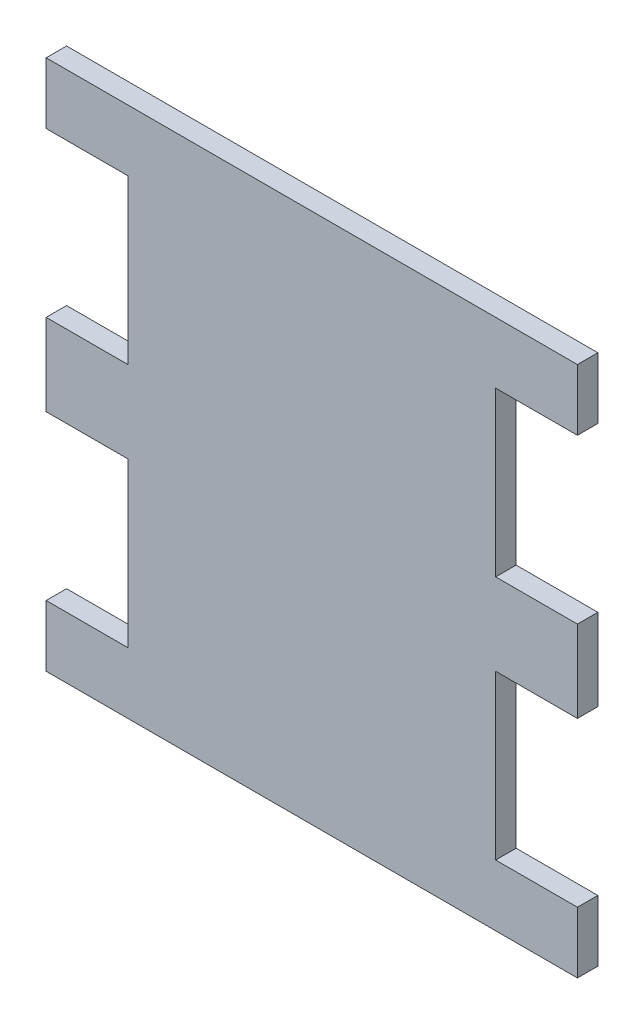
ISO-10303-21;
HEADER;
FILE_DESCRIPTION(('STEP AP214'),'2;1');
FILE_NAME('part.step','',(''),(''),'','','');
FILE_SCHEMA(('AUTOMOTIVE_DESIGN { 1 0 10303 214 1 1 1 1 }'));
ENDSEC;
DATA;
#1=APPLICATION_CONTEXT('core data for automotive mechanical design processes');
#2=APPLICATION_PROTOCOL_DEFINITION('international standard','automotive_design',2000,#1);
#3=PRODUCT_CONTEXT('',#1,'mechanical');
#4=PRODUCT('Part','Part','',(#3));
#5=PRODUCT_RELATED_PRODUCT_CATEGORY('part','',(#4));
#6=PRODUCT_DEFINITION_FORMATION('','',#4);
#7=PRODUCT_DEFINITION_CONTEXT('part definition',#1,'design');
#8=PRODUCT_DEFINITION('design','',#6,#7);
#9=PRODUCT_DEFINITION_SHAPE('','',#8);
#10=(LENGTH_UNIT() NAMED_UNIT(*) SI_UNIT(.MILLI.,.METRE.));
#11=(NAMED_UNIT(*) PLANE_ANGLE_UNIT() SI_UNIT($,.RADIAN.));
#12=(NAMED_UNIT(*) SI_UNIT($,.STERADIAN.) SOLID_ANGLE_UNIT());
#13=UNCERTAINTY_MEASURE_WITH_UNIT(LENGTH_MEASURE(1.E-05),#10,'distance_accuracy_value','');
#14=(GEOMETRIC_REPRESENTATION_CONTEXT(3) GLOBAL_UNCERTAINTY_ASSIGNED_CONTEXT((#13)) GLOBAL_UNIT_ASSIGNED_CONTEXT((#10,
#11,#12)) REPRESENTATION_CONTEXT('',''));
#15=CARTESIAN_POINT('',(0.,0.,0.));
#16=DIRECTION('',(0.,0.,1.));
#17=DIRECTION('',(1.,0.,0.));
#18=AXIS2_PLACEMENT_3D('',#15,#16,#17);
#19=CARTESIAN_POINT('',(96.5740993958003,41.5718700475436,5.));
#20=DIRECTION('',(-1.,0.,0.));
#21=DIRECTION('',(0.,-1.,0.));
#22=AXIS2_PLACEMENT_3D('',#19,#20,#21);
#23=PLANE('',#22);
#24=DIRECTION('',(0.,1.,0.));
#25=VECTOR('',#24,1.);
#26=CARTESIAN_POINT('',(96.5740993958003,41.5718700475436,0.));
#27=LINE('',#26,#25);
#28=CARTESIAN_POINT('',(96.5740993958003,-88.4281299524564,0.));
#29=VERTEX_POINT('',#28);
#30=CARTESIAN_POINT('',(96.5740993958003,-73.4281299524564,0.));
#31=VERTEX_POINT('',#30);
#32=EDGE_CURVE('E211',#29,#31,#27,.T.);
#33=ORIENTED_EDGE('',*,*,#32,.T.);
#34=DIRECTION('',(0.,0.,1.));
#35=VECTOR('',#34,1.);
#36=CARTESIAN_POINT('',(96.5740993958003,-73.4281299524564,-5.));
#37=LINE('',#36,#35);
#38=CARTESIAN_POINT('',(96.5740993958003,-73.4281299524564,5.));
#39=VERTEX_POINT('',#38);
#40=EDGE_CURVE('E265',#31,#39,#37,.T.);
#41=ORIENTED_EDGE('',*,*,#40,.T.);
#42=DIRECTION('',(0.,1.,0.));
#43=VECTOR('',#42,1.);
#44=CARTESIAN_POINT('',(96.5740993958003,41.5718700475436,5.));
#45=LINE('',#44,#43);
#46=CARTESIAN_POINT('',(96.5740993958003,-88.4281299524564,5.));
#47=VERTEX_POINT('',#46);
#48=EDGE_CURVE('E192',#47,#39,#45,.T.);
#49=ORIENTED_EDGE('',*,*,#48,.F.);
#50=DIRECTION('',(0.,0.,-1.));
#51=VECTOR('',#50,1.);
#52=CARTESIAN_POINT('',(96.5740993958003,-88.4281299524564,5.));
#53=LINE('',#52,#51);
#54=EDGE_CURVE('E223',#47,#29,#53,.T.);
#55=ORIENTED_EDGE('',*,*,#54,.T.);
#56=EDGE_LOOP('',(#33,#41,#49,#55));
#57=FACE_BOUND('',#56,.T.);
#58=ADVANCED_FACE('F32',(#57),#23,.F.);
#59=CARTESIAN_POINT('',(96.5740993958003,-33.4281299524564,5.));
#60=VERTEX_POINT('',#59);
#61=CARTESIAN_POINT('',(96.5740993958003,-13.4281299524564,5.));
#62=VERTEX_POINT('',#61);
#63=EDGE_CURVE('E183',#60,#62,#45,.T.);
#64=ORIENTED_EDGE('',*,*,#63,.F.);
#65=DIRECTION('',(0.,0.,1.));
#66=VECTOR('',#65,1.);
#67=CARTESIAN_POINT('',(96.5740993958003,-33.4281299524564,-5.));
#68=LINE('',#67,#66);
#69=CARTESIAN_POINT('',(96.5740993958003,-33.4281299524564,0.));
#70=VERTEX_POINT('',#69);
#71=EDGE_CURVE('E167',#70,#60,#68,.T.);
#72=ORIENTED_EDGE('',*,*,#71,.F.);
#73=CARTESIAN_POINT('',(96.5740993958003,-13.4281299524564,0.));
#74=VERTEX_POINT('',#73);
#75=EDGE_CURVE('E215',#70,#74,#27,.T.);
#76=ORIENTED_EDGE('',*,*,#75,.T.);
#77=DIRECTION('',(0.,0.,1.));
#78=VECTOR('',#77,1.);
#79=CARTESIAN_POINT('',(96.5740993958003,-13.4281299524564,-5.));
#80=LINE('',#79,#78);
#81=EDGE_CURVE('E191',#74,#62,#80,.T.);
#82=ORIENTED_EDGE('',*,*,#81,.T.);
#83=EDGE_LOOP('',(#64,#72,#76,#82));
#84=FACE_BOUND('',#83,.T.);
#85=ADVANCED_FACE('F189',(#84),#23,.F.);
#86=CARTESIAN_POINT('',(-33.4259006041997,41.5718700475436,5.));
#87=DIRECTION('',(1.,0.,0.));
#88=DIRECTION('',(0.,1.,0.));
#89=AXIS2_PLACEMENT_3D('',#86,#87,#88);
#90=PLANE('',#89);
#91=DIRECTION('',(0.,-1.,0.));
#92=VECTOR('',#91,1.);
#93=CARTESIAN_POINT('',(-33.4259006041997,41.5718700475436,0.));
#94=LINE('',#93,#92);
#95=CARTESIAN_POINT('',(-33.4259006041997,-13.4281299524564,0.));
#96=VERTEX_POINT('',#95);
#97=CARTESIAN_POINT('',(-33.4259006041997,-33.4281299524564,0.));
#98=VERTEX_POINT('',#97);
#99=EDGE_CURVE('E207',#96,#98,#94,.T.);
#100=ORIENTED_EDGE('',*,*,#99,.T.);
#101=DIRECTION('',(0.,0.,1.));
#102=VECTOR('',#101,1.);
#103=CARTESIAN_POINT('',(-33.4259006041997,-33.4281299524564,-5.));
#104=LINE('',#103,#102);
#105=CARTESIAN_POINT('',(-33.4259006041997,-33.4281299524564,5.));
#106=VERTEX_POINT('',#105);
#107=EDGE_CURVE('E294',#98,#106,#104,.T.);
#108=ORIENTED_EDGE('',*,*,#107,.T.);
#109=DIRECTION('',(0.,-1.,0.));
#110=VECTOR('',#109,1.);
#111=CARTESIAN_POINT('',(-33.4259006041997,41.5718700475436,5.));
#112=LINE('',#111,#110);
#113=CARTESIAN_POINT('',(-33.4259006041997,-13.4281299524564,5.));
#114=VERTEX_POINT('',#113);
#115=EDGE_CURVE('E320',#114,#106,#112,.T.);
#116=ORIENTED_EDGE('',*,*,#115,.F.);
#117=DIRECTION('',(0.,0.,1.));
#118=VECTOR('',#117,1.);
#119=CARTESIAN_POINT('',(-33.4259006041997,-13.4281299524564,-5.));
#120=LINE('',#119,#118);
#121=EDGE_CURVE('E310',#96,#114,#120,.T.);
#122=ORIENTED_EDGE('',*,*,#121,.F.);
#123=EDGE_LOOP('',(#100,#108,#116,#122));
#124=FACE_BOUND('',#123,.T.);
#125=ADVANCED_FACE('F356',(#124),#90,.F.);
#126=CARTESIAN_POINT('',(-33.4259006041997,41.5718700475436,0.));
#127=VERTEX_POINT('',#126);
#128=CARTESIAN_POINT('',(-33.4259006041997,26.5718700475436,0.));
#129=VERTEX_POINT('',#128);
#130=EDGE_CURVE('E203',#127,#129,#94,.T.);
#131=ORIENTED_EDGE('',*,*,#130,.T.);
#132=DIRECTION('',(0.,0.,1.));
#133=VECTOR('',#132,1.);
#134=CARTESIAN_POINT('',(-33.4259006041997,26.5718700475436,-5.));
#135=LINE('',#134,#133);
#136=CARTESIAN_POINT('',(-33.4259006041997,26.5718700475436,5.));
#137=VERTEX_POINT('',#136);
#138=EDGE_CURVE('E311',#129,#137,#135,.T.);
#139=ORIENTED_EDGE('',*,*,#138,.T.);
#140=CARTESIAN_POINT('',(-33.4259006041997,41.5718700475436,5.));
#141=VERTEX_POINT('',#140);
#142=EDGE_CURVE('E318',#141,#137,#112,.T.);
#143=ORIENTED_EDGE('',*,*,#142,.F.);
#144=DIRECTION('',(0.,0.,-1.));
#145=VECTOR('',#144,1.);
#146=CARTESIAN_POINT('',(-33.4259006041997,41.5718700475436,5.));
#147=LINE('',#146,#145);
#148=EDGE_CURVE('E202',#141,#127,#147,.T.);
#149=ORIENTED_EDGE('',*,*,#148,.T.);
#150=EDGE_LOOP('',(#131,#139,#143,#149));
#151=FACE_BOUND('',#150,.T.);
#152=ADVANCED_FACE('F506',(#151),#90,.F.);
#153=CARTESIAN_POINT('',(-33.4259006041997,-73.4281299524564,5.));
#154=VERTEX_POINT('',#153);
#155=CARTESIAN_POINT('',(-33.4259006041997,-88.4281299524564,5.));
#156=VERTEX_POINT('',#155);
#157=EDGE_CURVE('E217',#154,#156,#112,.T.);
#158=ORIENTED_EDGE('',*,*,#157,.F.);
#159=DIRECTION('',(0.,0.,1.));
#160=VECTOR('',#159,1.);
#161=CARTESIAN_POINT('',(-33.4259006041997,-73.4281299524564,-5.));
#162=LINE('',#161,#160);
#163=CARTESIAN_POINT('',(-33.4259006041997,-73.4281299524564,0.));
#164=VERTEX_POINT('',#163);
#165=EDGE_CURVE('E293',#164,#154,#162,.T.);
#166=ORIENTED_EDGE('',*,*,#165,.F.);
#167=CARTESIAN_POINT('',(-33.4259006041997,-88.4281299524564,0.));
#168=VERTEX_POINT('',#167);
#169=EDGE_CURVE('E208',#164,#168,#94,.T.);
#170=ORIENTED_EDGE('',*,*,#169,.T.);
#171=DIRECTION('',(0.,0.,-1.));
#172=VECTOR('',#171,1.);
#173=CARTESIAN_POINT('',(-33.4259006041997,-88.4281299524564,5.));
#174=LINE('',#173,#172);
#175=EDGE_CURVE('E226',#156,#168,#174,.T.);
#176=ORIENTED_EDGE('',*,*,#175,.F.);
#177=EDGE_LOOP('',(#158,#166,#170,#176));
#178=FACE_BOUND('',#177,.T.);
#179=ADVANCED_FACE('F34',(#178),#90,.F.);
#180=CARTESIAN_POINT('',(-33.4259006041997,-88.4281299524564,5.));
#181=DIRECTION('',(0.,1.,0.));
#182=DIRECTION('',(0.,0.,1.));
#183=AXIS2_PLACEMENT_3D('',#180,#181,#182);
#184=PLANE('',#183);
#185=DIRECTION('',(1.,0.,0.));
#186=VECTOR('',#185,1.);
#187=CARTESIAN_POINT('',(-33.4259006041997,-88.4281299524564,0.));
#188=LINE('',#187,#186);
#189=EDGE_CURVE('E206',#168,#29,#188,.T.);
#190=ORIENTED_EDGE('',*,*,#189,.T.);
#191=ORIENTED_EDGE('',*,*,#54,.F.);
#192=DIRECTION('',(1.,0.,0.));
#193=VECTOR('',#192,1.);
#194=CARTESIAN_POINT('',(-33.4259006041997,-88.4281299524564,5.));
#195=LINE('',#194,#193);
#196=EDGE_CURVE('E197',#156,#47,#195,.T.);
#197=ORIENTED_EDGE('',*,*,#196,.F.);
#198=ORIENTED_EDGE('',*,*,#175,.T.);
#199=EDGE_LOOP('',(#190,#191,#197,#198));
#200=FACE_BOUND('',#199,.T.);
#201=ADVANCED_FACE('F333',(#200),#184,.F.);
#202=CARTESIAN_POINT('',(96.5740993958003,26.5718700475436,5.));
#203=VERTEX_POINT('',#202);
#204=CARTESIAN_POINT('',(96.5740993958003,41.5718700475436,5.));
#205=VERTEX_POINT('',#204);
#206=EDGE_CURVE('E193',#203,#205,#45,.T.);
#207=ORIENTED_EDGE('',*,*,#206,.F.);
#208=DIRECTION('',(0.,0.,1.));
#209=VECTOR('',#208,1.);
#210=CARTESIAN_POINT('',(96.5740993958003,26.5718700475436,-5.));
#211=LINE('',#210,#209);
#212=CARTESIAN_POINT('',(96.5740993958003,26.5718700475436,0.));
#213=VERTEX_POINT('',#212);
#214=EDGE_CURVE('E279',#213,#203,#211,.T.);
#215=ORIENTED_EDGE('',*,*,#214,.F.);
#216=CARTESIAN_POINT('',(96.5740993958003,41.5718700475436,0.));
#217=VERTEX_POINT('',#216);
#218=EDGE_CURVE('E210',#213,#217,#27,.T.);
#219=ORIENTED_EDGE('',*,*,#218,.T.);
#220=DIRECTION('',(0.,0.,-1.));
#221=VECTOR('',#220,1.);
#222=CARTESIAN_POINT('',(96.5740993958003,41.5718700475436,5.));
#223=LINE('',#222,#221);
#224=EDGE_CURVE('E220',#205,#217,#223,.T.);
#225=ORIENTED_EDGE('',*,*,#224,.F.);
#226=EDGE_LOOP('',(#207,#215,#219,#225));
#227=FACE_BOUND('',#226,.T.);
#228=ADVANCED_FACE('F352',(#227),#23,.F.);
#229=CARTESIAN_POINT('',(-33.4259006041997,41.5718700475436,5.));
#230=DIRECTION('',(0.,-1.,0.));
#231=DIRECTION('',(0.,0.,-1.));
#232=AXIS2_PLACEMENT_3D('',#229,#230,#231);
#233=PLANE('',#232);
#234=DIRECTION('',(-1.,0.,0.));
#235=VECTOR('',#234,1.);
#236=CARTESIAN_POINT('',(-33.4259006041997,41.5718700475436,0.));
#237=LINE('',#236,#235);
#238=EDGE_CURVE('E214',#217,#127,#237,.T.);
#239=ORIENTED_EDGE('',*,*,#238,.T.);
#240=ORIENTED_EDGE('',*,*,#148,.F.);
#241=DIRECTION('',(-1.,0.,0.));
#242=VECTOR('',#241,1.);
#243=CARTESIAN_POINT('',(-33.4259006041997,41.5718700475436,5.));
#244=LINE('',#243,#242);
#245=EDGE_CURVE('E196',#205,#141,#244,.T.);
#246=ORIENTED_EDGE('',*,*,#245,.F.);
#247=ORIENTED_EDGE('',*,*,#224,.T.);
#248=EDGE_LOOP('',(#239,#240,#246,#247));
#249=FACE_BOUND('',#248,.T.);
#250=ADVANCED_FACE('F359',(#249),#233,.F.);
#251=CARTESIAN_POINT('',(0.,0.,5.));
#252=DIRECTION('',(0.,0.,1.));
#253=DIRECTION('',(1.,0.,0.));
#254=AXIS2_PLACEMENT_3D('',#251,#252,#253);
#255=PLANE('',#254);
#256=DIRECTION('',(1.,0.,0.));
#257=VECTOR('',#256,1.);
#258=CARTESIAN_POINT('',(96.5740993958003,-73.4281299524564,5.));
#259=LINE('',#258,#257);
#260=CARTESIAN_POINT('',(76.5740993958003,-73.4281299524564,5.));
#261=VERTEX_POINT('',#260);
#262=EDGE_CURVE('E177',#261,#39,#259,.T.);
#263=ORIENTED_EDGE('',*,*,#262,.F.);
#264=DIRECTION('',(0.,-1.,0.));
#265=VECTOR('',#264,1.);
#266=CARTESIAN_POINT('',(76.5740993958003,-33.4281299524564,5.));
#267=LINE('',#266,#265);
#268=CARTESIAN_POINT('',(76.5740993958003,-33.4281299524564,5.));
#269=VERTEX_POINT('',#268);
#270=EDGE_CURVE('E186',#269,#261,#267,.T.);
#271=ORIENTED_EDGE('',*,*,#270,.F.);
#272=DIRECTION('',(-1.,0.,0.));
#273=VECTOR('',#272,1.);
#274=CARTESIAN_POINT('',(96.5740993958003,-33.4281299524564,5.));
#275=LINE('',#274,#273);
#276=EDGE_CURVE('E170',#60,#269,#275,.T.);
#277=ORIENTED_EDGE('',*,*,#276,.F.);
#278=ORIENTED_EDGE('',*,*,#63,.T.);
#279=DIRECTION('',(1.,0.,0.));
#280=VECTOR('',#279,1.);
#281=CARTESIAN_POINT('',(96.5740993958003,-13.4281299524564,5.));
#282=LINE('',#281,#280);
#283=CARTESIAN_POINT('',(76.5740993958003,-13.4281299524564,5.));
#284=VERTEX_POINT('',#283);
#285=EDGE_CURVE('E277',#284,#62,#282,.T.);
#286=ORIENTED_EDGE('',*,*,#285,.F.);
#287=DIRECTION('',(0.,-1.,0.));
#288=VECTOR('',#287,1.);
#289=CARTESIAN_POINT('',(76.5740993958003,26.5718700475436,5.));
#290=LINE('',#289,#288);
#291=CARTESIAN_POINT('',(76.5740993958003,26.5718700475436,5.));
#292=VERTEX_POINT('',#291);
#293=EDGE_CURVE('E274',#292,#284,#290,.T.);
#294=ORIENTED_EDGE('',*,*,#293,.F.);
#295=DIRECTION('',(-1.,0.,0.));
#296=VECTOR('',#295,1.);
#297=CARTESIAN_POINT('',(96.5740993958003,26.5718700475436,5.));
#298=LINE('',#297,#296);
#299=EDGE_CURVE('E268',#203,#292,#298,.T.);
#300=ORIENTED_EDGE('',*,*,#299,.F.);
#301=ORIENTED_EDGE('',*,*,#206,.T.);
#302=ORIENTED_EDGE('',*,*,#245,.T.);
#303=ORIENTED_EDGE('',*,*,#142,.T.);
#304=DIRECTION('',(-1.,0.,0.));
#305=VECTOR('',#304,1.);
#306=CARTESIAN_POINT('',(-33.4259006041997,26.5718700475436,5.));
#307=LINE('',#306,#305);
#308=CARTESIAN_POINT('',(-13.4259006041997,26.5718700475436,5.));
#309=VERTEX_POINT('',#308);
#310=EDGE_CURVE('E308',#309,#137,#307,.T.);
#311=ORIENTED_EDGE('',*,*,#310,.F.);
#312=DIRECTION('',(0.,1.,0.));
#313=VECTOR('',#312,1.);
#314=CARTESIAN_POINT('',(-13.4259006041997,26.5718700475436,5.));
#315=LINE('',#314,#313);
#316=CARTESIAN_POINT('',(-13.4259006041997,-13.4281299524564,5.));
#317=VERTEX_POINT('',#316);
#318=EDGE_CURVE('E305',#317,#309,#315,.T.);
#319=ORIENTED_EDGE('',*,*,#318,.F.);
#320=DIRECTION('',(1.,0.,0.));
#321=VECTOR('',#320,1.);
#322=CARTESIAN_POINT('',(-33.4259006041997,-13.4281299524564,5.));
#323=LINE('',#322,#321);
#324=EDGE_CURVE('E297',#114,#317,#323,.T.);
#325=ORIENTED_EDGE('',*,*,#324,.F.);
#326=ORIENTED_EDGE('',*,*,#115,.T.);
#327=DIRECTION('',(-1.,0.,0.));
#328=VECTOR('',#327,1.);
#329=CARTESIAN_POINT('',(-33.4259006041997,-33.4281299524564,5.));
#330=LINE('',#329,#328);
#331=CARTESIAN_POINT('',(-13.4259006041997,-33.4281299524564,5.));
#332=VERTEX_POINT('',#331);
#333=EDGE_CURVE('E291',#332,#106,#330,.T.);
#334=ORIENTED_EDGE('',*,*,#333,.F.);
#335=DIRECTION('',(0.,1.,0.));
#336=VECTOR('',#335,1.);
#337=CARTESIAN_POINT('',(-13.4259006041997,-33.4281299524564,5.));
#338=LINE('',#337,#336);
#339=CARTESIAN_POINT('',(-13.4259006041997,-73.4281299524564,5.));
#340=VERTEX_POINT('',#339);
#341=EDGE_CURVE('E288',#340,#332,#338,.T.);
#342=ORIENTED_EDGE('',*,*,#341,.F.);
#343=DIRECTION('',(1.,0.,0.));
#344=VECTOR('',#343,1.);
#345=CARTESIAN_POINT('',(-33.4259006041997,-73.4281299524564,5.));
#346=LINE('',#345,#344);
#347=EDGE_CURVE('E281',#154,#340,#346,.T.);
#348=ORIENTED_EDGE('',*,*,#347,.F.);
#349=ORIENTED_EDGE('',*,*,#157,.T.);
#350=ORIENTED_EDGE('',*,*,#196,.T.);
#351=ORIENTED_EDGE('',*,*,#48,.T.);
#352=EDGE_LOOP('',(#263,#271,#277,#278,#286,#294,#300,#301,#302,#303,#311,#319,#325,#326,#334,
#342,#348,#349,#350,#351));
#353=FACE_BOUND('',#352,.T.);
#354=ADVANCED_FACE('F181',(#353),#255,.T.);
#355=CARTESIAN_POINT('',(0.,0.,0.));
#356=DIRECTION('',(0.,0.,1.));
#357=DIRECTION('',(1.,0.,0.));
#358=AXIS2_PLACEMENT_3D('',#355,#356,#357);
#359=PLANE('',#358);
#360=DIRECTION('',(0.,-1.,0.));
#361=VECTOR('',#360,1.);
#362=CARTESIAN_POINT('',(76.5740993958003,0.,0.));
#363=LINE('',#362,#361);
#364=CARTESIAN_POINT('',(76.5740993958003,-33.4281299524564,0.));
#365=VERTEX_POINT('',#364);
#366=CARTESIAN_POINT('',(76.5740993958003,-73.4281299524564,0.));
#367=VERTEX_POINT('',#366);
#368=EDGE_CURVE('E40',#365,#367,#363,.T.);
#369=ORIENTED_EDGE('',*,*,#368,.T.);
#370=DIRECTION('',(1.,0.,0.));
#371=VECTOR('',#370,1.);
#372=CARTESIAN_POINT('',(0.,-73.4281299524564,0.));
#373=LINE('',#372,#371);
#374=EDGE_CURVE('E11',#367,#31,#373,.T.);
#375=ORIENTED_EDGE('',*,*,#374,.T.);
#376=ORIENTED_EDGE('',*,*,#32,.F.);
#377=ORIENTED_EDGE('',*,*,#189,.F.);
#378=ORIENTED_EDGE('',*,*,#169,.F.);
#379=DIRECTION('',(1.,0.,0.));
#380=VECTOR('',#379,1.);
#381=CARTESIAN_POINT('',(0.,-73.4281299524564,0.));
#382=LINE('',#381,#380);
#383=CARTESIAN_POINT('',(-13.4259006041997,-73.4281299524564,0.));
#384=VERTEX_POINT('',#383);
#385=EDGE_CURVE('E238',#164,#384,#382,.T.);
#386=ORIENTED_EDGE('',*,*,#385,.T.);
#387=DIRECTION('',(0.,1.,0.));
#388=VECTOR('',#387,1.);
#389=CARTESIAN_POINT('',(-13.4259006041997,0.,0.));
#390=LINE('',#389,#388);
#391=CARTESIAN_POINT('',(-13.4259006041997,-33.4281299524564,0.));
#392=VERTEX_POINT('',#391);
#393=EDGE_CURVE('E241',#384,#392,#390,.T.);
#394=ORIENTED_EDGE('',*,*,#393,.T.);
#395=DIRECTION('',(-1.,0.,0.));
#396=VECTOR('',#395,1.);
#397=CARTESIAN_POINT('',(0.,-33.4281299524564,0.));
#398=LINE('',#397,#396);
#399=EDGE_CURVE('E244',#392,#98,#398,.T.);
#400=ORIENTED_EDGE('',*,*,#399,.T.);
#401=ORIENTED_EDGE('',*,*,#99,.F.);
#402=DIRECTION('',(1.,0.,0.));
#403=VECTOR('',#402,1.);
#404=CARTESIAN_POINT('',(0.,-13.4281299524564,0.));
#405=LINE('',#404,#403);
#406=CARTESIAN_POINT('',(-13.4259006041997,-13.4281299524564,0.));
#407=VERTEX_POINT('',#406);
#408=EDGE_CURVE('E229',#96,#407,#405,.T.);
#409=ORIENTED_EDGE('',*,*,#408,.T.);
#410=DIRECTION('',(0.,1.,0.));
#411=VECTOR('',#410,1.);
#412=CARTESIAN_POINT('',(-13.4259006041997,0.,0.));
#413=LINE('',#412,#411);
#414=CARTESIAN_POINT('',(-13.4259006041997,26.5718700475436,0.));
#415=VERTEX_POINT('',#414);
#416=EDGE_CURVE('E232',#407,#415,#413,.T.);
#417=ORIENTED_EDGE('',*,*,#416,.T.);
#418=DIRECTION('',(-1.,0.,0.));
#419=VECTOR('',#418,1.);
#420=CARTESIAN_POINT('',(0.,26.5718700475436,0.));
#421=LINE('',#420,#419);
#422=EDGE_CURVE('E235',#415,#129,#421,.T.);
#423=ORIENTED_EDGE('',*,*,#422,.T.);
#424=ORIENTED_EDGE('',*,*,#130,.F.);
#425=ORIENTED_EDGE('',*,*,#238,.F.);
#426=ORIENTED_EDGE('',*,*,#218,.F.);
#427=DIRECTION('',(-1.,0.,0.));
#428=VECTOR('',#427,1.);
#429=CARTESIAN_POINT('',(0.,26.5718700475436,0.));
#430=LINE('',#429,#428);
#431=CARTESIAN_POINT('',(76.5740993958003,26.5718700475436,0.));
#432=VERTEX_POINT('',#431);
#433=EDGE_CURVE('E247',#213,#432,#430,.T.);
#434=ORIENTED_EDGE('',*,*,#433,.T.);
#435=DIRECTION('',(0.,-1.,0.));
#436=VECTOR('',#435,1.);
#437=CARTESIAN_POINT('',(76.5740993958003,0.,0.));
#438=LINE('',#437,#436);
#439=CARTESIAN_POINT('',(76.5740993958003,-13.4281299524564,0.));
#440=VERTEX_POINT('',#439);
#441=EDGE_CURVE('E250',#432,#440,#438,.T.);
#442=ORIENTED_EDGE('',*,*,#441,.T.);
#443=DIRECTION('',(1.,0.,0.));
#444=VECTOR('',#443,1.);
#445=CARTESIAN_POINT('',(0.,-13.4281299524564,0.));
#446=LINE('',#445,#444);
#447=EDGE_CURVE('E253',#440,#74,#446,.T.);
#448=ORIENTED_EDGE('',*,*,#447,.T.);
#449=ORIENTED_EDGE('',*,*,#75,.F.);
#450=DIRECTION('',(-1.,0.,0.));
#451=VECTOR('',#450,1.);
#452=CARTESIAN_POINT('',(0.,-33.4281299524564,0.));
#453=LINE('',#452,#451);
#454=EDGE_CURVE('E173',#70,#365,#453,.T.);
#455=ORIENTED_EDGE('',*,*,#454,.T.);
#456=EDGE_LOOP('',(#369,#375,#376,#377,#378,#386,#394,#400,#401,#409,#417,#423,#424,#425,#426,
#434,#442,#448,#449,#455));
#457=FACE_BOUND('',#456,.T.);
#458=ADVANCED_FACE('F258',(#457),#359,.F.);
#459=CARTESIAN_POINT('',(-33.4259006041997,26.5718700475436,-5.));
#460=DIRECTION('',(0.,1.,0.));
#461=DIRECTION('',(0.,0.,1.));
#462=AXIS2_PLACEMENT_3D('',#459,#460,#461);
#463=PLANE('',#462);
#464=DIRECTION('',(0.,0.,1.));
#465=VECTOR('',#464,1.);
#466=CARTESIAN_POINT('',(-13.4259006041997,26.5718700475436,-5.));
#467=LINE('',#466,#465);
#468=EDGE_CURVE('E314',#415,#309,#467,.T.);
#469=ORIENTED_EDGE('',*,*,#468,.T.);
#470=ORIENTED_EDGE('',*,*,#310,.T.);
#471=ORIENTED_EDGE('',*,*,#138,.F.);
#472=ORIENTED_EDGE('',*,*,#422,.F.);
#473=EDGE_LOOP('',(#469,#470,#471,#472));
#474=FACE_BOUND('',#473,.T.);
#475=ADVANCED_FACE('F401',(#474),#463,.F.);
#476=CARTESIAN_POINT('',(-13.4259006041997,26.5718700475436,-5.));
#477=DIRECTION('',(1.,0.,0.));
#478=DIRECTION('',(0.,1.,0.));
#479=AXIS2_PLACEMENT_3D('',#476,#477,#478);
#480=PLANE('',#479);
#481=DIRECTION('',(0.,0.,1.));
#482=VECTOR('',#481,1.);
#483=CARTESIAN_POINT('',(-13.4259006041997,-13.4281299524564,-5.));
#484=LINE('',#483,#482);
#485=EDGE_CURVE('E316',#407,#317,#484,.T.);
#486=ORIENTED_EDGE('',*,*,#485,.T.);
#487=ORIENTED_EDGE('',*,*,#318,.T.);
#488=ORIENTED_EDGE('',*,*,#468,.F.);
#489=ORIENTED_EDGE('',*,*,#416,.F.);
#490=EDGE_LOOP('',(#486,#487,#488,#489));
#491=FACE_BOUND('',#490,.T.);
#492=ADVANCED_FACE('F404',(#491),#480,.F.);
#493=CARTESIAN_POINT('',(-33.4259006041997,-13.4281299524564,-5.));
#494=DIRECTION('',(0.,-1.,0.));
#495=DIRECTION('',(0.,0.,-1.));
#496=AXIS2_PLACEMENT_3D('',#493,#494,#495);
#497=PLANE('',#496);
#498=ORIENTED_EDGE('',*,*,#121,.T.);
#499=ORIENTED_EDGE('',*,*,#324,.T.);
#500=ORIENTED_EDGE('',*,*,#485,.F.);
#501=ORIENTED_EDGE('',*,*,#408,.F.);
#502=EDGE_LOOP('',(#498,#499,#500,#501));
#503=FACE_BOUND('',#502,.T.);
#504=ADVANCED_FACE('F393',(#503),#497,.F.);
#505=CARTESIAN_POINT('',(-33.4259006041997,-33.4281299524564,-5.));
#506=DIRECTION('',(0.,1.,0.));
#507=DIRECTION('',(-1.,0.,0.));
#508=AXIS2_PLACEMENT_3D('',#505,#506,#507);
#509=PLANE('',#508);
#510=DIRECTION('',(0.,0.,1.));
#511=VECTOR('',#510,1.);
#512=CARTESIAN_POINT('',(-13.4259006041997,-33.4281299524564,-5.));
#513=LINE('',#512,#511);
#514=EDGE_CURVE('E298',#392,#332,#513,.T.);
#515=ORIENTED_EDGE('',*,*,#514,.T.);
#516=ORIENTED_EDGE('',*,*,#333,.T.);
#517=ORIENTED_EDGE('',*,*,#107,.F.);
#518=ORIENTED_EDGE('',*,*,#399,.F.);
#519=EDGE_LOOP('',(#515,#516,#517,#518));
#520=FACE_BOUND('',#519,.T.);
#521=ADVANCED_FACE('F389',(#520),#509,.F.);
#522=CARTESIAN_POINT('',(-13.4259006041997,-33.4281299524564,-5.));
#523=DIRECTION('',(1.,0.,0.));
#524=DIRECTION('',(0.,1.,0.));
#525=AXIS2_PLACEMENT_3D('',#522,#523,#524);
#526=PLANE('',#525);
#527=DIRECTION('',(0.,0.,1.));
#528=VECTOR('',#527,1.);
#529=CARTESIAN_POINT('',(-13.4259006041997,-73.4281299524564,-5.));
#530=LINE('',#529,#528);
#531=EDGE_CURVE('E300',#384,#340,#530,.T.);
#532=ORIENTED_EDGE('',*,*,#531,.T.);
#533=ORIENTED_EDGE('',*,*,#341,.T.);
#534=ORIENTED_EDGE('',*,*,#514,.F.);
#535=ORIENTED_EDGE('',*,*,#393,.F.);
#536=EDGE_LOOP('',(#532,#533,#534,#535));
#537=FACE_BOUND('',#536,.T.);
#538=ADVANCED_FACE('F392',(#537),#526,.F.);
#539=CARTESIAN_POINT('',(-33.4259006041997,-73.4281299524564,-5.));
#540=DIRECTION('',(0.,-1.,0.));
#541=DIRECTION('',(0.,0.,-1.));
#542=AXIS2_PLACEMENT_3D('',#539,#540,#541);
#543=PLANE('',#542);
#544=ORIENTED_EDGE('',*,*,#165,.T.);
#545=ORIENTED_EDGE('',*,*,#347,.T.);
#546=ORIENTED_EDGE('',*,*,#531,.F.);
#547=ORIENTED_EDGE('',*,*,#385,.F.);
#548=EDGE_LOOP('',(#544,#545,#546,#547));
#549=FACE_BOUND('',#548,.T.);
#550=ADVANCED_FACE('F385',(#549),#543,.F.);
#551=CARTESIAN_POINT('',(96.5740993958003,-13.4281299524564,-5.));
#552=DIRECTION('',(0.,-1.,0.));
#553=DIRECTION('',(1.,0.,0.));
#554=AXIS2_PLACEMENT_3D('',#551,#552,#553);
#555=PLANE('',#554);
#556=DIRECTION('',(0.,0.,1.));
#557=VECTOR('',#556,1.);
#558=CARTESIAN_POINT('',(76.5740993958003,-13.4281299524564,-5.));
#559=LINE('',#558,#557);
#560=EDGE_CURVE('E282',#440,#284,#559,.T.);
#561=ORIENTED_EDGE('',*,*,#560,.T.);
#562=ORIENTED_EDGE('',*,*,#285,.T.);
#563=ORIENTED_EDGE('',*,*,#81,.F.);
#564=ORIENTED_EDGE('',*,*,#447,.F.);
#565=EDGE_LOOP('',(#561,#562,#563,#564));
#566=FACE_BOUND('',#565,.T.);
#567=ADVANCED_FACE('F377',(#566),#555,.F.);
#568=CARTESIAN_POINT('',(76.5740993958003,26.5718700475436,-5.));
#569=DIRECTION('',(-1.,0.,0.));
#570=DIRECTION('',(0.,0.,1.));
#571=AXIS2_PLACEMENT_3D('',#568,#569,#570);
#572=PLANE('',#571);
#573=DIRECTION('',(0.,0.,1.));
#574=VECTOR('',#573,1.);
#575=CARTESIAN_POINT('',(76.5740993958003,26.5718700475436,-5.));
#576=LINE('',#575,#574);
#577=EDGE_CURVE('E55',#432,#292,#576,.T.);
#578=ORIENTED_EDGE('',*,*,#577,.T.);
#579=ORIENTED_EDGE('',*,*,#293,.T.);
#580=ORIENTED_EDGE('',*,*,#560,.F.);
#581=ORIENTED_EDGE('',*,*,#441,.F.);
#582=EDGE_LOOP('',(#578,#579,#580,#581));
#583=FACE_BOUND('',#582,.T.);
#584=ADVANCED_FACE('F348',(#583),#572,.F.);
#585=CARTESIAN_POINT('',(96.5740993958003,26.5718700475436,-5.));
#586=DIRECTION('',(0.,1.,0.));
#587=DIRECTION('',(-1.,0.,0.));
#588=AXIS2_PLACEMENT_3D('',#585,#586,#587);
#589=PLANE('',#588);
#590=ORIENTED_EDGE('',*,*,#214,.T.);
#591=ORIENTED_EDGE('',*,*,#299,.T.);
#592=ORIENTED_EDGE('',*,*,#577,.F.);
#593=ORIENTED_EDGE('',*,*,#433,.F.);
#594=EDGE_LOOP('',(#590,#591,#592,#593));
#595=FACE_BOUND('',#594,.T.);
#596=ADVANCED_FACE('F341',(#595),#589,.F.);
#597=CARTESIAN_POINT('',(96.5740993958003,-73.4281299524564,-5.));
#598=DIRECTION('',(0.,-1.,0.));
#599=DIRECTION('',(0.,0.,-1.));
#600=AXIS2_PLACEMENT_3D('',#597,#598,#599);
#601=PLANE('',#600);
#602=DIRECTION('',(0.,0.,1.));
#603=VECTOR('',#602,1.);
#604=CARTESIAN_POINT('',(76.5740993958003,-73.4281299524564,-5.));
#605=LINE('',#604,#603);
#606=EDGE_CURVE('E263',#367,#261,#605,.T.);
#607=ORIENTED_EDGE('',*,*,#606,.T.);
#608=ORIENTED_EDGE('',*,*,#262,.T.);
#609=ORIENTED_EDGE('',*,*,#40,.F.);
#610=ORIENTED_EDGE('',*,*,#374,.F.);
#611=EDGE_LOOP('',(#607,#608,#609,#610));
#612=FACE_BOUND('',#611,.T.);
#613=ADVANCED_FACE('F339',(#612),#601,.F.);
#614=CARTESIAN_POINT('',(76.5740993958003,-33.4281299524564,-5.));
#615=DIRECTION('',(-1.,0.,0.));
#616=DIRECTION('',(0.,0.,1.));
#617=AXIS2_PLACEMENT_3D('',#614,#615,#616);
#618=PLANE('',#617);
#619=DIRECTION('',(0.,0.,1.));
#620=VECTOR('',#619,1.);
#621=CARTESIAN_POINT('',(76.5740993958003,-33.4281299524564,-5.));
#622=LINE('',#621,#620);
#623=EDGE_CURVE('E47',#365,#269,#622,.T.);
#624=ORIENTED_EDGE('',*,*,#623,.T.);
#625=ORIENTED_EDGE('',*,*,#270,.T.);
#626=ORIENTED_EDGE('',*,*,#606,.F.);
#627=ORIENTED_EDGE('',*,*,#368,.F.);
#628=EDGE_LOOP('',(#624,#625,#626,#627));
#629=FACE_BOUND('',#628,.T.);
#630=ADVANCED_FACE('F262',(#629),#618,.F.);
#631=CARTESIAN_POINT('',(96.5740993958003,-33.4281299524564,-5.));
#632=DIRECTION('',(0.,1.,0.));
#633=DIRECTION('',(-1.,0.,0.));
#634=AXIS2_PLACEMENT_3D('',#631,#632,#633);
#635=PLANE('',#634);
#636=ORIENTED_EDGE('',*,*,#71,.T.);
#637=ORIENTED_EDGE('',*,*,#276,.T.);
#638=ORIENTED_EDGE('',*,*,#623,.F.);
#639=ORIENTED_EDGE('',*,*,#454,.F.);
#640=EDGE_LOOP('',(#636,#637,#638,#639));
#641=FACE_BOUND('',#640,.T.);
#642=ADVANCED_FACE('F169',(#641),#635,.F.);
#643=CLOSED_SHELL('',(#58,#85,#125,#152,#179,#201,#228,#250,#354,#458,#475,#492,#504,#521,#538,
#550,#567,#584,#596,#613,#630,#642));
#644=MANIFOLD_SOLID_BREP('B2',#643);
#645=ADVANCED_BREP_SHAPE_REPRESENTATION('',(#18,#644),#14);
#646=SHAPE_DEFINITION_REPRESENTATION(#9,#645);
ENDSEC;
END-ISO-10303-21;
